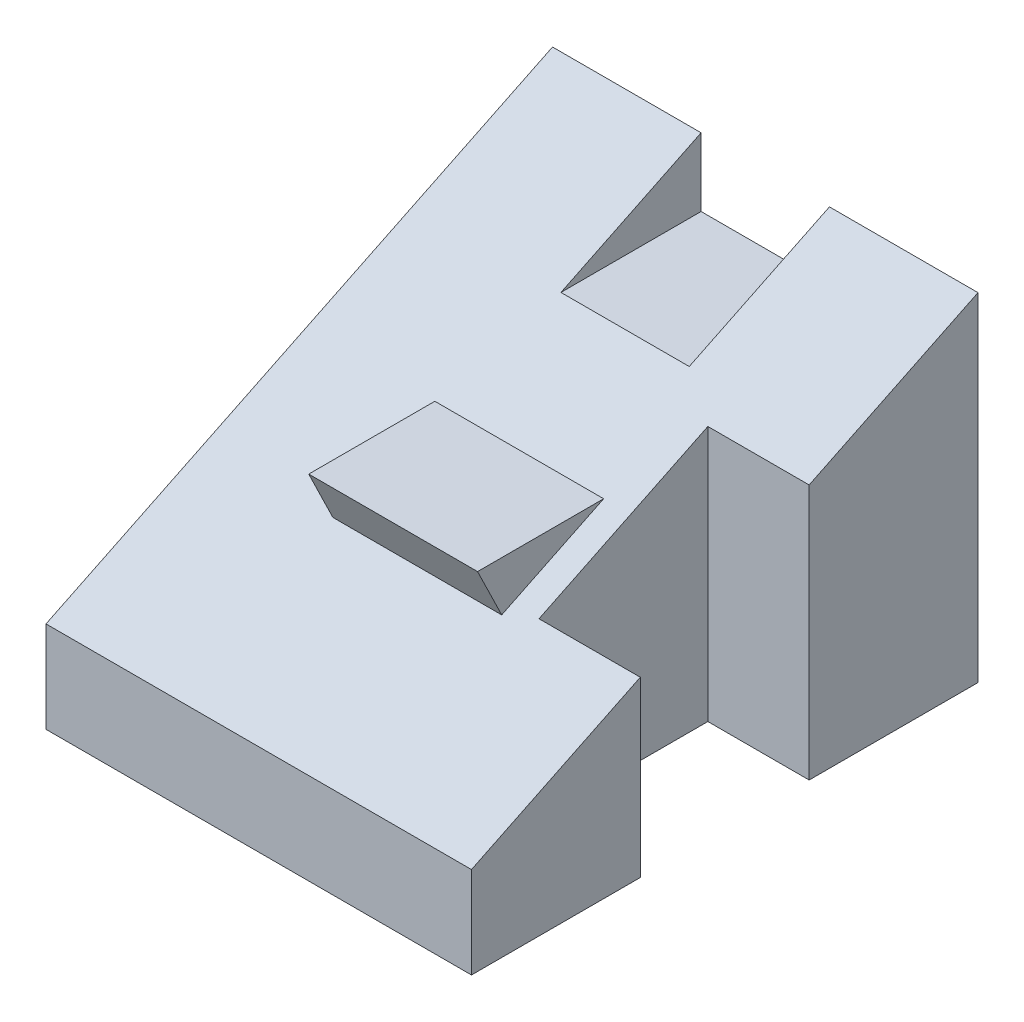
ISO-10303-21;
HEADER;
FILE_DESCRIPTION(('STEP AP214'),'2;1');
FILE_NAME('part.step','',(''),(''),'','','');
FILE_SCHEMA(('AUTOMOTIVE_DESIGN { 1 0 10303 214 1 1 1 1 }'));
ENDSEC;
DATA;
#1=APPLICATION_CONTEXT('core data for automotive mechanical design processes');
#2=APPLICATION_PROTOCOL_DEFINITION('international standard','automotive_design',2000,#1);
#3=PRODUCT_CONTEXT('',#1,'mechanical');
#4=PRODUCT('Part','Part','',(#3));
#5=PRODUCT_RELATED_PRODUCT_CATEGORY('part','',(#4));
#6=PRODUCT_DEFINITION_FORMATION('','',#4);
#7=PRODUCT_DEFINITION_CONTEXT('part definition',#1,'design');
#8=PRODUCT_DEFINITION('design','',#6,#7);
#9=PRODUCT_DEFINITION_SHAPE('','',#8);
#10=(LENGTH_UNIT() NAMED_UNIT(*) SI_UNIT(.MILLI.,.METRE.));
#11=(NAMED_UNIT(*) PLANE_ANGLE_UNIT() SI_UNIT($,.RADIAN.));
#12=(NAMED_UNIT(*) SI_UNIT($,.STERADIAN.) SOLID_ANGLE_UNIT());
#13=UNCERTAINTY_MEASURE_WITH_UNIT(LENGTH_MEASURE(1.E-05),#10,'distance_accuracy_value','');
#14=(GEOMETRIC_REPRESENTATION_CONTEXT(3) GLOBAL_UNCERTAINTY_ASSIGNED_CONTEXT((#13)) GLOBAL_UNIT_ASSIGNED_CONTEXT((#10,
#11,#12)) REPRESENTATION_CONTEXT('',''));
#15=CARTESIAN_POINT('',(0.,0.,0.));
#16=DIRECTION('',(0.,0.,1.));
#17=DIRECTION('',(1.,0.,0.));
#18=AXIS2_PLACEMENT_3D('',#15,#16,#17);
#19=CARTESIAN_POINT('',(0.,50.,-75.));
#20=DIRECTION('',(1.,0.,0.));
#21=DIRECTION('',(0.,0.,-1.));
#22=AXIS2_PLACEMENT_3D('',#19,#20,#21);
#23=PLANE('',#22);
#24=DIRECTION('',(0.,-1.,0.));
#25=VECTOR('',#24,1.);
#26=CARTESIAN_POINT('',(0.,50.,0.));
#27=LINE('',#26,#25);
#28=CARTESIAN_POINT('',(0.,13.5231525220751,0.));
#29=VERTEX_POINT('',#28);
#30=CARTESIAN_POINT('',(0.,0.,0.));
#31=VERTEX_POINT('',#30);
#32=EDGE_CURVE('E247',#29,#31,#27,.T.);
#33=ORIENTED_EDGE('',*,*,#32,.F.);
#34=DIRECTION('',(0.,0.437372259280763,-0.899280549557056));
#35=VECTOR('',#34,1.);
#36=CARTESIAN_POINT('',(0.,50.,-75.));
#37=LINE('',#36,#35);
#38=CARTESIAN_POINT('',(0.,50.,-75.));
#39=VERTEX_POINT('',#38);
#40=EDGE_CURVE('E190',#29,#39,#37,.T.);
#41=ORIENTED_EDGE('',*,*,#40,.T.);
#42=DIRECTION('',(0.,-1.,0.));
#43=VECTOR('',#42,1.);
#44=CARTESIAN_POINT('',(0.,50.,-75.));
#45=LINE('',#44,#43);
#46=CARTESIAN_POINT('',(0.,0.,-75.));
#47=VERTEX_POINT('',#46);
#48=EDGE_CURVE('E209',#39,#47,#45,.T.);
#49=ORIENTED_EDGE('',*,*,#48,.T.);
#50=DIRECTION('',(0.,0.,1.));
#51=VECTOR('',#50,1.);
#52=CARTESIAN_POINT('',(0.,0.,-75.));
#53=LINE('',#52,#51);
#54=EDGE_CURVE('E206',#47,#31,#53,.T.);
#55=ORIENTED_EDGE('',*,*,#54,.T.);
#56=EDGE_LOOP('',(#33,#41,#49,#55));
#57=FACE_BOUND('',#56,.T.);
#58=ADVANCED_FACE('F43',(#57),#23,.F.);
#59=CARTESIAN_POINT('',(0.,50.,0.));
#60=DIRECTION('',(0.,0.,-1.));
#61=DIRECTION('',(-1.,0.,0.));
#62=AXIS2_PLACEMENT_3D('',#59,#60,#61);
#63=PLANE('',#62);
#64=DIRECTION('',(0.,-1.,0.));
#65=VECTOR('',#64,1.);
#66=CARTESIAN_POINT('',(63.,50.,0.));
#67=LINE('',#66,#65);
#68=CARTESIAN_POINT('',(63.,13.5231525220751,0.));
#69=VERTEX_POINT('',#68);
#70=CARTESIAN_POINT('',(63.,0.,0.));
#71=VERTEX_POINT('',#70);
#72=EDGE_CURVE('E245',#69,#71,#67,.T.);
#73=ORIENTED_EDGE('',*,*,#72,.F.);
#74=DIRECTION('',(1.,0.,0.));
#75=VECTOR('',#74,1.);
#76=CARTESIAN_POINT('',(0.,13.5231525220751,0.));
#77=LINE('',#76,#75);
#78=EDGE_CURVE('E193',#29,#69,#77,.T.);
#79=ORIENTED_EDGE('',*,*,#78,.F.);
#80=ORIENTED_EDGE('',*,*,#32,.T.);
#81=DIRECTION('',(1.,0.,0.));
#82=VECTOR('',#81,1.);
#83=CARTESIAN_POINT('',(0.,0.,0.));
#84=LINE('',#83,#82);
#85=EDGE_CURVE('E213',#31,#71,#84,.T.);
#86=ORIENTED_EDGE('',*,*,#85,.T.);
#87=EDGE_LOOP('',(#73,#79,#80,#86));
#88=FACE_BOUND('',#87,.T.);
#89=ADVANCED_FACE('F272',(#88),#63,.F.);
#90=CARTESIAN_POINT('',(63.,50.,0.));
#91=DIRECTION('',(-1.,0.,0.));
#92=DIRECTION('',(0.,0.,1.));
#93=AXIS2_PLACEMENT_3D('',#90,#91,#92);
#94=PLANE('',#93);
#95=DIRECTION('',(0.,-1.,0.));
#96=VECTOR('',#95,1.);
#97=CARTESIAN_POINT('',(63.,50.,-25.));
#98=LINE('',#97,#96);
#99=CARTESIAN_POINT('',(63.,25.6821016813834,-25.));
#100=VERTEX_POINT('',#99);
#101=CARTESIAN_POINT('',(63.,0.,-25.));
#102=VERTEX_POINT('',#101);
#103=EDGE_CURVE('E243',#100,#102,#98,.T.);
#104=ORIENTED_EDGE('',*,*,#103,.F.);
#105=DIRECTION('',(0.,0.437372259280763,-0.899280549557056));
#106=VECTOR('',#105,1.);
#107=CARTESIAN_POINT('',(63.,50.,-75.));
#108=LINE('',#107,#106);
#109=EDGE_CURVE('E194',#69,#100,#108,.T.);
#110=ORIENTED_EDGE('',*,*,#109,.F.);
#111=ORIENTED_EDGE('',*,*,#72,.T.);
#112=DIRECTION('',(0.,0.,-1.));
#113=VECTOR('',#112,1.);
#114=CARTESIAN_POINT('',(63.,0.,0.));
#115=LINE('',#114,#113);
#116=EDGE_CURVE('E216',#71,#102,#115,.T.);
#117=ORIENTED_EDGE('',*,*,#116,.T.);
#118=EDGE_LOOP('',(#104,#110,#111,#117));
#119=FACE_BOUND('',#118,.T.);
#120=ADVANCED_FACE('F275',(#119),#94,.F.);
#121=CARTESIAN_POINT('',(63.,50.,-25.));
#122=DIRECTION('',(0.,0.,1.));
#123=DIRECTION('',(1.,0.,0.));
#124=AXIS2_PLACEMENT_3D('',#121,#122,#123);
#125=PLANE('',#124);
#126=DIRECTION('',(0.,-1.,0.));
#127=VECTOR('',#126,1.);
#128=CARTESIAN_POINT('',(48.,50.,-25.));
#129=LINE('',#128,#127);
#130=CARTESIAN_POINT('',(48.,25.6821016813834,-25.));
#131=VERTEX_POINT('',#130);
#132=CARTESIAN_POINT('',(48.,0.,-25.));
#133=VERTEX_POINT('',#132);
#134=EDGE_CURVE('E241',#131,#133,#129,.T.);
#135=ORIENTED_EDGE('',*,*,#134,.F.);
#136=DIRECTION('',(1.,0.,0.));
#137=VECTOR('',#136,1.);
#138=CARTESIAN_POINT('',(63.,25.6821016813834,-25.));
#139=LINE('',#138,#137);
#140=EDGE_CURVE('E203',#131,#100,#139,.T.);
#141=ORIENTED_EDGE('',*,*,#140,.T.);
#142=ORIENTED_EDGE('',*,*,#103,.T.);
#143=DIRECTION('',(-1.,0.,0.));
#144=VECTOR('',#143,1.);
#145=CARTESIAN_POINT('',(63.,0.,-25.));
#146=LINE('',#145,#144);
#147=EDGE_CURVE('E219',#102,#133,#146,.T.);
#148=ORIENTED_EDGE('',*,*,#147,.T.);
#149=EDGE_LOOP('',(#135,#141,#142,#148));
#150=FACE_BOUND('',#149,.T.);
#151=ADVANCED_FACE('F279',(#150),#125,.F.);
#152=CARTESIAN_POINT('',(48.,50.,-25.));
#153=DIRECTION('',(-1.,0.,0.));
#154=DIRECTION('',(0.,0.,1.));
#155=AXIS2_PLACEMENT_3D('',#152,#153,#154);
#156=PLANE('',#155);
#157=DIRECTION('',(0.,-1.,0.));
#158=VECTOR('',#157,1.);
#159=CARTESIAN_POINT('',(48.,50.,-50.));
#160=LINE('',#159,#158);
#161=CARTESIAN_POINT('',(48.,37.8410508406917,-50.));
#162=VERTEX_POINT('',#161);
#163=CARTESIAN_POINT('',(48.,0.,-50.));
#164=VERTEX_POINT('',#163);
#165=EDGE_CURVE('E239',#162,#164,#160,.T.);
#166=ORIENTED_EDGE('',*,*,#165,.F.);
#167=DIRECTION('',(0.,-0.437372259280763,0.899280549557056));
#168=VECTOR('',#167,1.);
#169=CARTESIAN_POINT('',(48.,30.3339817156492,-34.5647246594179));
#170=LINE('',#169,#168);
#171=EDGE_CURVE('E200',#162,#131,#170,.T.);
#172=ORIENTED_EDGE('',*,*,#171,.T.);
#173=ORIENTED_EDGE('',*,*,#134,.T.);
#174=DIRECTION('',(0.,0.,-1.));
#175=VECTOR('',#174,1.);
#176=CARTESIAN_POINT('',(48.,0.,-25.));
#177=LINE('',#176,#175);
#178=EDGE_CURVE('E222',#133,#164,#177,.T.);
#179=ORIENTED_EDGE('',*,*,#178,.T.);
#180=EDGE_LOOP('',(#166,#172,#173,#179));
#181=FACE_BOUND('',#180,.T.);
#182=ADVANCED_FACE('F283',(#181),#156,.F.);
#183=CARTESIAN_POINT('',(48.,50.,-50.));
#184=DIRECTION('',(0.,0.,-1.));
#185=DIRECTION('',(-1.,0.,0.));
#186=AXIS2_PLACEMENT_3D('',#183,#184,#185);
#187=PLANE('',#186);
#188=DIRECTION('',(0.,-1.,0.));
#189=VECTOR('',#188,1.);
#190=CARTESIAN_POINT('',(63.,50.,-50.));
#191=LINE('',#190,#189);
#192=CARTESIAN_POINT('',(63.,37.8410508406917,-50.));
#193=VERTEX_POINT('',#192);
#194=CARTESIAN_POINT('',(63.,0.,-50.));
#195=VERTEX_POINT('',#194);
#196=EDGE_CURVE('E237',#193,#195,#191,.T.);
#197=ORIENTED_EDGE('',*,*,#196,.F.);
#198=DIRECTION('',(-1.,0.,0.));
#199=VECTOR('',#198,1.);
#200=CARTESIAN_POINT('',(48.,37.8410508406917,-50.));
#201=LINE('',#200,#199);
#202=EDGE_CURVE('E197',#193,#162,#201,.T.);
#203=ORIENTED_EDGE('',*,*,#202,.T.);
#204=ORIENTED_EDGE('',*,*,#165,.T.);
#205=DIRECTION('',(1.,0.,0.));
#206=VECTOR('',#205,1.);
#207=CARTESIAN_POINT('',(48.,0.,-50.));
#208=LINE('',#207,#206);
#209=EDGE_CURVE('E225',#164,#195,#208,.T.);
#210=ORIENTED_EDGE('',*,*,#209,.T.);
#211=EDGE_LOOP('',(#197,#203,#204,#210));
#212=FACE_BOUND('',#211,.T.);
#213=ADVANCED_FACE('F286',(#212),#187,.F.);
#214=CARTESIAN_POINT('',(63.,50.,-50.));
#215=DIRECTION('',(-1.,0.,0.));
#216=DIRECTION('',(0.,0.,1.));
#217=AXIS2_PLACEMENT_3D('',#214,#215,#216);
#218=PLANE('',#217);
#219=DIRECTION('',(0.,-1.,0.));
#220=VECTOR('',#219,1.);
#221=CARTESIAN_POINT('',(63.,50.,-75.));
#222=LINE('',#221,#220);
#223=CARTESIAN_POINT('',(63.,50.,-75.));
#224=VERTEX_POINT('',#223);
#225=CARTESIAN_POINT('',(63.,0.,-75.));
#226=VERTEX_POINT('',#225);
#227=EDGE_CURVE('E234',#224,#226,#222,.T.);
#228=ORIENTED_EDGE('',*,*,#227,.F.);
#229=EDGE_CURVE('E189',#193,#224,#108,.T.);
#230=ORIENTED_EDGE('',*,*,#229,.F.);
#231=ORIENTED_EDGE('',*,*,#196,.T.);
#232=DIRECTION('',(0.,0.,-1.));
#233=VECTOR('',#232,1.);
#234=CARTESIAN_POINT('',(63.,0.,-50.));
#235=LINE('',#234,#233);
#236=EDGE_CURVE('E228',#195,#226,#235,.T.);
#237=ORIENTED_EDGE('',*,*,#236,.T.);
#238=EDGE_LOOP('',(#228,#230,#231,#237));
#239=FACE_BOUND('',#238,.T.);
#240=ADVANCED_FACE('F287',(#239),#218,.F.);
#241=CARTESIAN_POINT('',(63.,50.,-75.));
#242=DIRECTION('',(0.,0.,1.));
#243=DIRECTION('',(1.,0.,0.));
#244=AXIS2_PLACEMENT_3D('',#241,#242,#243);
#245=PLANE('',#244);
#246=DIRECTION('',(-1.,0.,0.));
#247=VECTOR('',#246,1.);
#248=CARTESIAN_POINT('',(0.,39.9051593786174,-75.));
#249=LINE('',#248,#247);
#250=CARTESIAN_POINT('',(41.,39.9051593786174,-75.));
#251=VERTEX_POINT('',#250);
#252=CARTESIAN_POINT('',(22.,39.9051593786174,-75.));
#253=VERTEX_POINT('',#252);
#254=EDGE_CURVE('E147',#251,#253,#249,.T.);
#255=ORIENTED_EDGE('',*,*,#254,.F.);
#256=DIRECTION('',(0.,-1.,0.));
#257=VECTOR('',#256,1.);
#258=CARTESIAN_POINT('',(41.,0.,-75.));
#259=LINE('',#258,#257);
#260=CARTESIAN_POINT('',(41.,50.,-75.));
#261=VERTEX_POINT('',#260);
#262=EDGE_CURVE('E155',#261,#251,#259,.T.);
#263=ORIENTED_EDGE('',*,*,#262,.F.);
#264=DIRECTION('',(-1.,0.,0.));
#265=VECTOR('',#264,1.);
#266=CARTESIAN_POINT('',(63.,50.,-75.));
#267=LINE('',#266,#265);
#268=EDGE_CURVE('E207',#224,#261,#267,.T.);
#269=ORIENTED_EDGE('',*,*,#268,.F.);
#270=ORIENTED_EDGE('',*,*,#227,.T.);
#271=DIRECTION('',(-1.,0.,0.));
#272=VECTOR('',#271,1.);
#273=CARTESIAN_POINT('',(63.,0.,-75.));
#274=LINE('',#273,#272);
#275=EDGE_CURVE('E230',#226,#47,#274,.T.);
#276=ORIENTED_EDGE('',*,*,#275,.T.);
#277=ORIENTED_EDGE('',*,*,#48,.F.);
#278=CARTESIAN_POINT('',(22.,50.,-75.));
#279=VERTEX_POINT('',#278);
#280=EDGE_CURVE('E210',#279,#39,#267,.T.);
#281=ORIENTED_EDGE('',*,*,#280,.F.);
#282=DIRECTION('',(0.,-1.,0.));
#283=VECTOR('',#282,1.);
#284=CARTESIAN_POINT('',(22.,0.,-75.));
#285=LINE('',#284,#283);
#286=EDGE_CURVE('E152',#279,#253,#285,.T.);
#287=ORIENTED_EDGE('',*,*,#286,.T.);
#288=EDGE_LOOP('',(#255,#263,#269,#270,#276,#277,#281,#287));
#289=FACE_BOUND('',#288,.T.);
#290=ADVANCED_FACE('F161',(#289),#245,.F.);
#291=CARTESIAN_POINT('',(0.,0.,0.));
#292=DIRECTION('',(0.,1.,0.));
#293=DIRECTION('',(0.,0.,1.));
#294=AXIS2_PLACEMENT_3D('',#291,#292,#293);
#295=PLANE('',#294);
#296=ORIENTED_EDGE('',*,*,#54,.F.);
#297=ORIENTED_EDGE('',*,*,#275,.F.);
#298=ORIENTED_EDGE('',*,*,#236,.F.);
#299=ORIENTED_EDGE('',*,*,#209,.F.);
#300=ORIENTED_EDGE('',*,*,#178,.F.);
#301=ORIENTED_EDGE('',*,*,#147,.F.);
#302=ORIENTED_EDGE('',*,*,#116,.F.);
#303=ORIENTED_EDGE('',*,*,#85,.F.);
#304=EDGE_LOOP('',(#296,#297,#298,#299,#300,#301,#302,#303));
#305=FACE_BOUND('',#304,.T.);
#306=ADVANCED_FACE('F262',(#305),#295,.F.);
#307=CARTESIAN_POINT('',(0.,50.,-75.));
#308=DIRECTION('',(0.,-0.899280549557056,-0.437372259280763));
#309=DIRECTION('',(0.,0.437372259280763,-0.899280549557056));
#310=AXIS2_PLACEMENT_3D('',#307,#308,#309);
#311=PLANE('',#310);
#312=DIRECTION('',(-1.,0.,0.));
#313=VECTOR('',#312,1.);
#314=CARTESIAN_POINT('',(0.,24.9398928159073,-23.4739452896965));
#315=LINE('',#314,#313);
#316=CARTESIAN_POINT('',(44.,24.9398928159073,-23.4739452896965));
#317=VERTEX_POINT('',#316);
#318=CARTESIAN_POINT('',(19.,24.9398928159073,-23.4739452896965));
#319=VERTEX_POINT('',#318);
#320=EDGE_CURVE('E177',#317,#319,#315,.T.);
#321=ORIENTED_EDGE('',*,*,#320,.T.);
#322=DIRECTION('',(0.,0.437372259280763,-0.899280549557056));
#323=VECTOR('',#322,1.);
#324=CARTESIAN_POINT('',(19.,10.9362479140558,5.31893129522386));
#325=LINE('',#324,#323);
#326=CARTESIAN_POINT('',(19.,32.2836192818205,-38.5733719952751));
#327=VERTEX_POINT('',#326);
#328=EDGE_CURVE('E174',#319,#327,#325,.T.);
#329=ORIENTED_EDGE('',*,*,#328,.T.);
#330=DIRECTION('',(1.,0.,0.));
#331=VECTOR('',#330,1.);
#332=CARTESIAN_POINT('',(0.,32.2836192818205,-38.5733719952751));
#333=LINE('',#332,#331);
#334=CARTESIAN_POINT('',(44.,32.2836192818205,-38.5733719952751));
#335=VERTEX_POINT('',#334);
#336=EDGE_CURVE('E183',#327,#335,#333,.T.);
#337=ORIENTED_EDGE('',*,*,#336,.T.);
#338=DIRECTION('',(0.,-0.437372259280763,0.899280549557056));
#339=VECTOR('',#338,1.);
#340=CARTESIAN_POINT('',(44.,10.9362479140558,5.31893129522386));
#341=LINE('',#340,#339);
#342=EDGE_CURVE('E180',#335,#317,#341,.T.);
#343=ORIENTED_EDGE('',*,*,#342,.T.);
#344=EDGE_LOOP('',(#321,#329,#337,#343));
#345=FACE_BOUND('',#344,.T.);
#346=ORIENTED_EDGE('',*,*,#268,.T.);
#347=DIRECTION('',(0.,-0.437372259280763,0.899280549557056));
#348=VECTOR('',#347,1.);
#349=CARTESIAN_POINT('',(41.,50.,-75.));
#350=LINE('',#349,#348);
#351=CARTESIAN_POINT('',(41.,39.9051593786174,-54.2440109562132));
#352=VERTEX_POINT('',#351);
#353=EDGE_CURVE('E11',#261,#352,#350,.T.);
#354=ORIENTED_EDGE('',*,*,#353,.T.);
#355=DIRECTION('',(-1.,0.,0.));
#356=VECTOR('',#355,1.);
#357=CARTESIAN_POINT('',(0.,39.9051593786174,-54.2440109562132));
#358=LINE('',#357,#356);
#359=CARTESIAN_POINT('',(22.,39.9051593786174,-54.2440109562132));
#360=VERTEX_POINT('',#359);
#361=EDGE_CURVE('E150',#352,#360,#358,.T.);
#362=ORIENTED_EDGE('',*,*,#361,.T.);
#363=DIRECTION('',(0.,-0.437372259280763,0.899280549557056));
#364=VECTOR('',#363,1.);
#365=CARTESIAN_POINT('',(22.,50.,-75.));
#366=LINE('',#365,#364);
#367=EDGE_CURVE('E50',#279,#360,#366,.T.);
#368=ORIENTED_EDGE('',*,*,#367,.F.);
#369=ORIENTED_EDGE('',*,*,#280,.T.);
#370=ORIENTED_EDGE('',*,*,#40,.F.);
#371=ORIENTED_EDGE('',*,*,#78,.T.);
#372=ORIENTED_EDGE('',*,*,#109,.T.);
#373=ORIENTED_EDGE('',*,*,#140,.F.);
#374=ORIENTED_EDGE('',*,*,#171,.F.);
#375=ORIENTED_EDGE('',*,*,#202,.F.);
#376=ORIENTED_EDGE('',*,*,#229,.T.);
#377=EDGE_LOOP('',(#346,#354,#362,#368,#369,#370,#371,#372,#373,#374,#375,#376));
#378=FACE_BOUND('',#377,.T.);
#379=ADVANCED_FACE('F253',(#345,#378),#311,.F.);
#380=CARTESIAN_POINT('',(19.,25.3247367069687,12.3168874437161));
#381=DIRECTION('',(-1.,0.,0.));
#382=DIRECTION('',(0.,0.,1.));
#383=AXIS2_PLACEMENT_3D('',#380,#381,#382);
#384=PLANE('',#383);
#385=DIRECTION('',(0.,0.,-1.));
#386=VECTOR('',#385,1.);
#387=CARTESIAN_POINT('',(19.,32.2836192818205,-38.5733719952751));
#388=LINE('',#387,#386);
#389=CARTESIAN_POINT('',(19.,32.2836192818205,-19.9022654201403));
#390=VERTEX_POINT('',#389);
#391=EDGE_CURVE('E168',#390,#327,#388,.T.);
#392=ORIENTED_EDGE('',*,*,#391,.T.);
#393=ORIENTED_EDGE('',*,*,#328,.F.);
#394=DIRECTION('',(0.,-0.899280549557056,-0.437372259280763));
#395=VECTOR('',#394,1.);
#396=CARTESIAN_POINT('',(19.,39.3283816088202,-16.4759891412043));
#397=LINE('',#396,#395);
#398=EDGE_CURVE('E65',#390,#319,#397,.T.);
#399=ORIENTED_EDGE('',*,*,#398,.F.);
#400=EDGE_LOOP('',(#392,#393,#399));
#401=FACE_BOUND('',#400,.T.);
#402=ADVANCED_FACE('F328',(#401),#384,.T.);
#403=CARTESIAN_POINT('',(0.,39.3283816088202,-16.4759891412043));
#404=DIRECTION('',(0.,-0.437372259280763,0.899280549557056));
#405=DIRECTION('',(0.,-0.899280549557056,-0.437372259280763));
#406=AXIS2_PLACEMENT_3D('',#403,#404,#405);
#407=PLANE('',#406);
#408=DIRECTION('',(1.,0.,0.));
#409=VECTOR('',#408,1.);
#410=CARTESIAN_POINT('',(19.,32.2836192818205,-19.9022654201403));
#411=LINE('',#410,#409);
#412=CARTESIAN_POINT('',(44.,32.2836192818205,-19.9022654201403));
#413=VERTEX_POINT('',#412);
#414=EDGE_CURVE('E171',#390,#413,#411,.T.);
#415=ORIENTED_EDGE('',*,*,#414,.F.);
#416=ORIENTED_EDGE('',*,*,#398,.T.);
#417=ORIENTED_EDGE('',*,*,#320,.F.);
#418=DIRECTION('',(0.,-0.899280549557056,-0.437372259280763));
#419=VECTOR('',#418,1.);
#420=CARTESIAN_POINT('',(44.,39.3283816088202,-16.4759891412043));
#421=LINE('',#420,#419);
#422=EDGE_CURVE('E186',#413,#317,#421,.T.);
#423=ORIENTED_EDGE('',*,*,#422,.F.);
#424=EDGE_LOOP('',(#415,#416,#417,#423));
#425=FACE_BOUND('',#424,.T.);
#426=ADVANCED_FACE('F333',(#425),#407,.T.);
#427=CARTESIAN_POINT('',(44.,25.3247367069687,12.3168874437161));
#428=DIRECTION('',(1.,0.,0.));
#429=DIRECTION('',(0.,0.,-1.));
#430=AXIS2_PLACEMENT_3D('',#427,#428,#429);
#431=PLANE('',#430);
#432=DIRECTION('',(0.,0.,-1.));
#433=VECTOR('',#432,1.);
#434=CARTESIAN_POINT('',(44.,32.2836192818205,-38.5733719952751));
#435=LINE('',#434,#433);
#436=EDGE_CURVE('E166',#413,#335,#435,.T.);
#437=ORIENTED_EDGE('',*,*,#436,.F.);
#438=ORIENTED_EDGE('',*,*,#422,.T.);
#439=ORIENTED_EDGE('',*,*,#342,.F.);
#440=EDGE_LOOP('',(#437,#438,#439));
#441=FACE_BOUND('',#440,.T.);
#442=ADVANCED_FACE('F346',(#441),#431,.T.);
#443=CARTESIAN_POINT('',(19.,32.2836192818205,-38.5733719952751));
#444=DIRECTION('',(0.,-1.,0.));
#445=DIRECTION('',(0.,0.,-1.));
#446=AXIS2_PLACEMENT_3D('',#443,#444,#445);
#447=PLANE('',#446);
#448=ORIENTED_EDGE('',*,*,#436,.T.);
#449=ORIENTED_EDGE('',*,*,#336,.F.);
#450=ORIENTED_EDGE('',*,*,#391,.F.);
#451=ORIENTED_EDGE('',*,*,#414,.T.);
#452=EDGE_LOOP('',(#448,#449,#450,#451));
#453=FACE_BOUND('',#452,.T.);
#454=ADVANCED_FACE('F356',(#453),#447,.F.);
#455=CARTESIAN_POINT('',(41.,0.,-50.));
#456=DIRECTION('',(1.,0.,0.));
#457=DIRECTION('',(0.,1.,0.));
#458=AXIS2_PLACEMENT_3D('',#455,#456,#457);
#459=PLANE('',#458);
#460=ORIENTED_EDGE('',*,*,#262,.T.);
#461=DIRECTION('',(0.,0.,-1.));
#462=VECTOR('',#461,1.);
#463=CARTESIAN_POINT('',(41.,39.9051593786174,-50.));
#464=LINE('',#463,#462);
#465=EDGE_CURVE('E143',#352,#251,#464,.T.);
#466=ORIENTED_EDGE('',*,*,#465,.F.);
#467=ORIENTED_EDGE('',*,*,#353,.F.);
#468=EDGE_LOOP('',(#460,#466,#467));
#469=FACE_BOUND('',#468,.T.);
#470=ADVANCED_FACE('F156',(#469),#459,.F.);
#471=CARTESIAN_POINT('',(22.,0.,-50.));
#472=DIRECTION('',(1.,0.,0.));
#473=DIRECTION('',(0.,1.,0.));
#474=AXIS2_PLACEMENT_3D('',#471,#472,#473);
#475=PLANE('',#474);
#476=ORIENTED_EDGE('',*,*,#367,.T.);
#477=DIRECTION('',(0.,0.,-1.));
#478=VECTOR('',#477,1.);
#479=CARTESIAN_POINT('',(22.,39.9051593786174,-50.));
#480=LINE('',#479,#478);
#481=EDGE_CURVE('E57',#360,#253,#480,.T.);
#482=ORIENTED_EDGE('',*,*,#481,.T.);
#483=ORIENTED_EDGE('',*,*,#286,.F.);
#484=EDGE_LOOP('',(#476,#482,#483));
#485=FACE_BOUND('',#484,.T.);
#486=ADVANCED_FACE('F251',(#485),#475,.T.);
#487=CARTESIAN_POINT('',(0.,39.9051593786174,-50.));
#488=DIRECTION('',(0.,-1.,0.));
#489=DIRECTION('',(0.,0.,-1.));
#490=AXIS2_PLACEMENT_3D('',#487,#488,#489);
#491=PLANE('',#490);
#492=ORIENTED_EDGE('',*,*,#465,.T.);
#493=ORIENTED_EDGE('',*,*,#254,.T.);
#494=ORIENTED_EDGE('',*,*,#481,.F.);
#495=ORIENTED_EDGE('',*,*,#361,.F.);
#496=EDGE_LOOP('',(#492,#493,#494,#495));
#497=FACE_BOUND('',#496,.T.);
#498=ADVANCED_FACE('F145',(#497),#491,.F.);
#499=CLOSED_SHELL('',(#58,#89,#120,#151,#182,#213,#240,#290,#306,#379,#402,#426,#442,#454,#470,
#486,#498));
#500=MANIFOLD_SOLID_BREP('B2',#499);
#501=ADVANCED_BREP_SHAPE_REPRESENTATION('',(#18,#500),#14);
#502=SHAPE_DEFINITION_REPRESENTATION(#9,#501);
ENDSEC;
END-ISO-10303-21;
